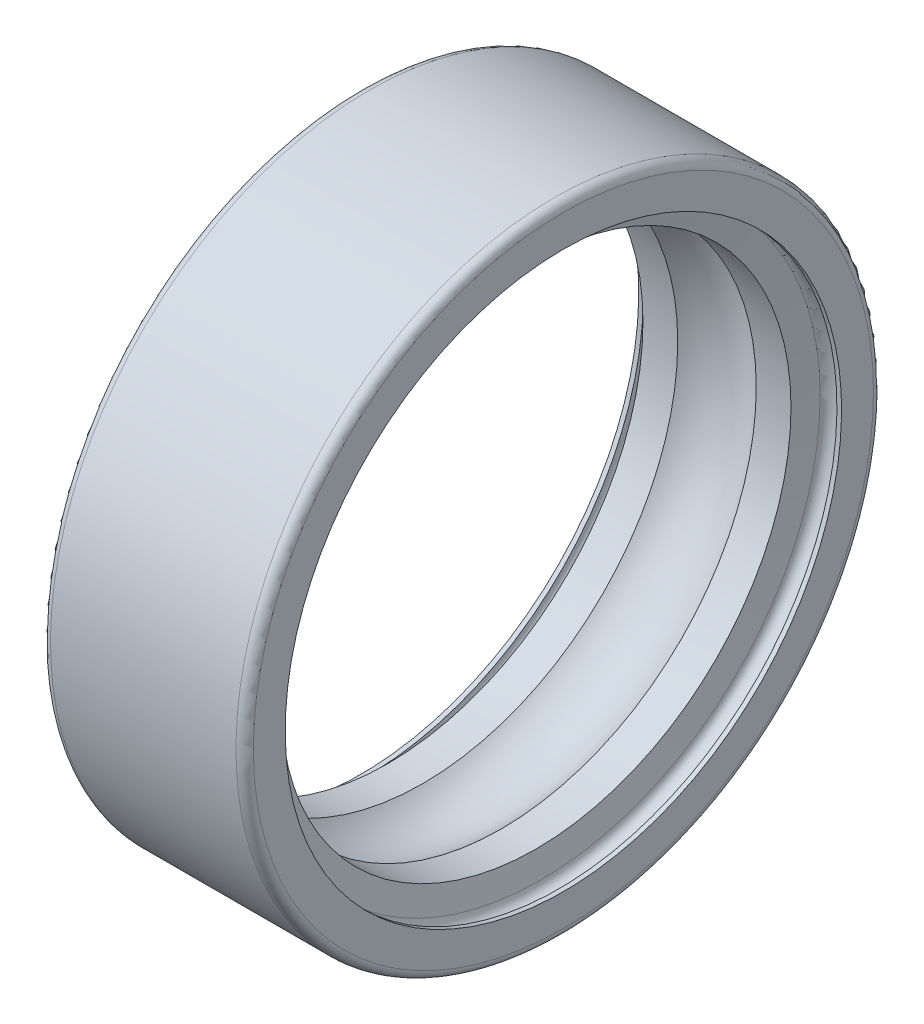
ISO-10303-21;
HEADER;
FILE_DESCRIPTION(('STEP AP214'),'2;1');
FILE_NAME('part.step','',(''),(''),'','','');
FILE_SCHEMA(('AUTOMOTIVE_DESIGN { 1 0 10303 214 1 1 1 1 }'));
ENDSEC;
DATA;
#1=APPLICATION_CONTEXT('core data for automotive mechanical design processes');
#2=APPLICATION_PROTOCOL_DEFINITION('international standard','automotive_design',2000,#1);
#3=PRODUCT_CONTEXT('',#1,'mechanical');
#4=PRODUCT('Part','Part','',(#3));
#5=PRODUCT_RELATED_PRODUCT_CATEGORY('part','',(#4));
#6=PRODUCT_DEFINITION_FORMATION('','',#4);
#7=PRODUCT_DEFINITION_CONTEXT('part definition',#1,'design');
#8=PRODUCT_DEFINITION('design','',#6,#7);
#9=PRODUCT_DEFINITION_SHAPE('','',#8);
#10=(LENGTH_UNIT() NAMED_UNIT(*) SI_UNIT(.MILLI.,.METRE.));
#11=(NAMED_UNIT(*) PLANE_ANGLE_UNIT() SI_UNIT($,.RADIAN.));
#12=(NAMED_UNIT(*) SI_UNIT($,.STERADIAN.) SOLID_ANGLE_UNIT());
#13=UNCERTAINTY_MEASURE_WITH_UNIT(LENGTH_MEASURE(1.E-05),#10,'distance_accuracy_value','');
#14=(GEOMETRIC_REPRESENTATION_CONTEXT(3) GLOBAL_UNCERTAINTY_ASSIGNED_CONTEXT((#13)) GLOBAL_UNIT_ASSIGNED_CONTEXT((#10,
#11,#12)) REPRESENTATION_CONTEXT('',''));
#15=CARTESIAN_POINT('',(0.,0.,0.));
#16=DIRECTION('',(0.,0.,1.));
#17=DIRECTION('',(1.,0.,0.));
#18=AXIS2_PLACEMENT_3D('',#15,#16,#17);
#19=CARTESIAN_POINT('',(6.52,0.,0.));
#20=DIRECTION('',(1.,0.,0.));
#21=DIRECTION('',(0.,0.,1.));
#22=AXIS2_PLACEMENT_3D('',#19,#20,#21);
#23=TOROIDAL_SURFACE('',#22,9.6,0.32);
#24=CARTESIAN_POINT('',(6.84,0.,0.));
#25=DIRECTION('',(-1.,0.,0.));
#26=DIRECTION('',(0.,1.,0.));
#27=AXIS2_PLACEMENT_3D('',#24,#25,#26);
#28=CIRCLE('',#27,9.6);
#29=CARTESIAN_POINT('',(6.84,9.6,0.));
#30=VERTEX_POINT('',#29);
#31=EDGE_CURVE('E11',#30,#30,#28,.T.);
#32=ORIENTED_EDGE('',*,*,#31,.F.);
#33=EDGE_LOOP('',(#32));
#34=FACE_BOUND('',#33,.T.);
#35=CARTESIAN_POINT('',(6.20486151903609,0.,0.));
#36=DIRECTION('',(-1.,0.,0.));
#37=DIRECTION('',(0.,1.,0.));
#38=AXIS2_PLACEMENT_3D('',#35,#36,#37);
#39=CIRCLE('',#38,9.65556741685342);
#40=CARTESIAN_POINT('',(6.20486151903609,9.65556741685342,0.));
#41=VERTEX_POINT('',#40);
#42=EDGE_CURVE('E82',#41,#41,#39,.T.);
#43=ORIENTED_EDGE('',*,*,#42,.T.);
#44=EDGE_LOOP('',(#43));
#45=FACE_BOUND('',#44,.T.);
#46=ADVANCED_FACE('F35',(#34,#45),#23,.F.);
#47=CARTESIAN_POINT('',(6.92,0.,0.));
#48=DIRECTION('',(-1.,0.,0.));
#49=DIRECTION('',(0.,1.,0.));
#50=AXIS2_PLACEMENT_3D('',#47,#48,#49);
#51=CYLINDRICAL_SURFACE('',#50,9.6);
#52=CARTESIAN_POINT('',(7.,0.,0.));
#53=DIRECTION('',(-1.,0.,0.));
#54=DIRECTION('',(0.,1.,0.));
#55=AXIS2_PLACEMENT_3D('',#52,#53,#54);
#56=CIRCLE('',#55,9.6);
#57=CARTESIAN_POINT('',(7.,9.6,0.));
#58=VERTEX_POINT('',#57);
#59=EDGE_CURVE('E45',#58,#58,#56,.T.);
#60=ORIENTED_EDGE('',*,*,#59,.F.);
#61=EDGE_LOOP('',(#60));
#62=FACE_BOUND('',#61,.T.);
#63=ORIENTED_EDGE('',*,*,#31,.T.);
#64=EDGE_LOOP('',(#63));
#65=FACE_BOUND('',#64,.T.);
#66=ADVANCED_FACE('F142',(#62,#65),#51,.F.);
#67=CARTESIAN_POINT('',(7.,10.15,0.));
#68=DIRECTION('',(1.,0.,0.));
#69=DIRECTION('',(0.,1.,0.));
#70=AXIS2_PLACEMENT_3D('',#67,#68,#69);
#71=PLANE('',#70);
#72=CARTESIAN_POINT('',(7.,0.,0.));
#73=DIRECTION('',(-1.,0.,0.));
#74=DIRECTION('',(0.,1.,0.));
#75=AXIS2_PLACEMENT_3D('',#72,#73,#74);
#76=CIRCLE('',#75,10.7);
#77=CARTESIAN_POINT('',(7.,10.7,0.));
#78=VERTEX_POINT('',#77);
#79=EDGE_CURVE('E102',#78,#78,#76,.T.);
#80=ORIENTED_EDGE('',*,*,#79,.F.);
#81=EDGE_LOOP('',(#80));
#82=FACE_BOUND('',#81,.T.);
#83=ORIENTED_EDGE('',*,*,#59,.T.);
#84=EDGE_LOOP('',(#83));
#85=FACE_BOUND('',#84,.T.);
#86=ADVANCED_FACE('F137',(#82,#85),#71,.T.);
#87=CARTESIAN_POINT('',(6.7,0.,0.));
#88=DIRECTION('',(1.,0.,0.));
#89=DIRECTION('',(0.,0.,1.));
#90=AXIS2_PLACEMENT_3D('',#87,#88,#89);
#91=TOROIDAL_SURFACE('',#90,10.7,0.3);
#92=CARTESIAN_POINT('',(6.7,0.,0.));
#93=DIRECTION('',(-1.,0.,0.));
#94=DIRECTION('',(0.,1.,0.));
#95=AXIS2_PLACEMENT_3D('',#92,#93,#94);
#96=CIRCLE('',#95,11.);
#97=CARTESIAN_POINT('',(6.7,11.,0.));
#98=VERTEX_POINT('',#97);
#99=EDGE_CURVE('E105',#98,#98,#96,.T.);
#100=ORIENTED_EDGE('',*,*,#99,.F.);
#101=EDGE_LOOP('',(#100));
#102=FACE_BOUND('',#101,.T.);
#103=ORIENTED_EDGE('',*,*,#79,.T.);
#104=EDGE_LOOP('',(#103));
#105=FACE_BOUND('',#104,.T.);
#106=ADVANCED_FACE('F103',(#102,#105),#91,.T.);
#107=CARTESIAN_POINT('',(3.5,0.,0.));
#108=DIRECTION('',(-1.,0.,0.));
#109=DIRECTION('',(0.,1.,0.));
#110=AXIS2_PLACEMENT_3D('',#107,#108,#109);
#111=CYLINDRICAL_SURFACE('',#110,11.);
#112=CARTESIAN_POINT('',(0.3,0.,0.));
#113=DIRECTION('',(-1.,0.,0.));
#114=DIRECTION('',(0.,1.,0.));
#115=AXIS2_PLACEMENT_3D('',#112,#113,#114);
#116=CIRCLE('',#115,11.);
#117=CARTESIAN_POINT('',(0.3,11.,0.));
#118=VERTEX_POINT('',#117);
#119=EDGE_CURVE('E108',#118,#118,#116,.T.);
#120=ORIENTED_EDGE('',*,*,#119,.F.);
#121=EDGE_LOOP('',(#120));
#122=FACE_BOUND('',#121,.T.);
#123=ORIENTED_EDGE('',*,*,#99,.T.);
#124=EDGE_LOOP('',(#123));
#125=FACE_BOUND('',#124,.T.);
#126=ADVANCED_FACE('F130',(#122,#125),#111,.T.);
#127=CARTESIAN_POINT('',(0.3,0.,0.));
#128=DIRECTION('',(1.,0.,0.));
#129=DIRECTION('',(0.,0.,1.));
#130=AXIS2_PLACEMENT_3D('',#127,#128,#129);
#131=TOROIDAL_SURFACE('',#130,10.7,0.3);
#132=CARTESIAN_POINT('',(0.,0.,0.));
#133=DIRECTION('',(-1.,0.,0.));
#134=DIRECTION('',(0.,1.,0.));
#135=AXIS2_PLACEMENT_3D('',#132,#133,#134);
#136=CIRCLE('',#135,10.7);
#137=CARTESIAN_POINT('',(0.,10.7,0.));
#138=VERTEX_POINT('',#137);
#139=EDGE_CURVE('E120',#138,#138,#136,.T.);
#140=ORIENTED_EDGE('',*,*,#139,.F.);
#141=EDGE_LOOP('',(#140));
#142=FACE_BOUND('',#141,.T.);
#143=ORIENTED_EDGE('',*,*,#119,.T.);
#144=EDGE_LOOP('',(#143));
#145=FACE_BOUND('',#144,.T.);
#146=ADVANCED_FACE('F128',(#142,#145),#131,.T.);
#147=CARTESIAN_POINT('',(0.,10.15,0.));
#148=DIRECTION('',(-1.,0.,0.));
#149=DIRECTION('',(0.,-1.,0.));
#150=AXIS2_PLACEMENT_3D('',#147,#148,#149);
#151=PLANE('',#150);
#152=CARTESIAN_POINT('',(0.,0.,0.));
#153=DIRECTION('',(-1.,0.,0.));
#154=DIRECTION('',(0.,1.,0.));
#155=AXIS2_PLACEMENT_3D('',#152,#153,#154);
#156=CIRCLE('',#155,9.6);
#157=CARTESIAN_POINT('',(0.,9.6,0.));
#158=VERTEX_POINT('',#157);
#159=EDGE_CURVE('E70',#158,#158,#156,.T.);
#160=ORIENTED_EDGE('',*,*,#159,.F.);
#161=EDGE_LOOP('',(#160));
#162=FACE_BOUND('',#161,.T.);
#163=ORIENTED_EDGE('',*,*,#139,.T.);
#164=EDGE_LOOP('',(#163));
#165=FACE_BOUND('',#164,.T.);
#166=ADVANCED_FACE('F155',(#162,#165),#151,.T.);
#167=CARTESIAN_POINT('',(0.08,0.,0.));
#168=DIRECTION('',(-1.,0.,0.));
#169=DIRECTION('',(0.,1.,0.));
#170=AXIS2_PLACEMENT_3D('',#167,#168,#169);
#171=CYLINDRICAL_SURFACE('',#170,9.6);
#172=CARTESIAN_POINT('',(0.16,0.,0.));
#173=DIRECTION('',(-1.,0.,0.));
#174=DIRECTION('',(0.,1.,0.));
#175=AXIS2_PLACEMENT_3D('',#172,#173,#174);
#176=CIRCLE('',#175,9.6);
#177=CARTESIAN_POINT('',(0.16,9.6,0.));
#178=VERTEX_POINT('',#177);
#179=EDGE_CURVE('E75',#178,#178,#176,.T.);
#180=ORIENTED_EDGE('',*,*,#179,.F.);
#181=EDGE_LOOP('',(#180));
#182=FACE_BOUND('',#181,.T.);
#183=ORIENTED_EDGE('',*,*,#159,.T.);
#184=EDGE_LOOP('',(#183));
#185=FACE_BOUND('',#184,.T.);
#186=ADVANCED_FACE('F177',(#182,#185),#171,.F.);
#187=CARTESIAN_POINT('',(0.48,0.,0.));
#188=DIRECTION('',(1.,0.,0.));
#189=DIRECTION('',(0.,0.,1.));
#190=AXIS2_PLACEMENT_3D('',#187,#188,#189);
#191=TOROIDAL_SURFACE('',#190,9.6,0.32);
#192=CARTESIAN_POINT('',(0.795138480963905,0.,0.));
#193=DIRECTION('',(-1.,0.,0.));
#194=DIRECTION('',(0.,1.,0.));
#195=AXIS2_PLACEMENT_3D('',#192,#193,#194);
#196=CIRCLE('',#195,9.65556741685342);
#197=CARTESIAN_POINT('',(0.795138480963905,9.65556741685342,0.));
#198=VERTEX_POINT('',#197);
#199=EDGE_CURVE('E114',#198,#198,#196,.T.);
#200=ORIENTED_EDGE('',*,*,#199,.F.);
#201=EDGE_LOOP('',(#200));
#202=FACE_BOUND('',#201,.T.);
#203=ORIENTED_EDGE('',*,*,#179,.T.);
#204=EDGE_LOOP('',(#203));
#205=FACE_BOUND('',#204,.T.);
#206=ADVANCED_FACE('F172',(#202,#205),#191,.F.);
#207=CARTESIAN_POINT('',(0.870568290667057,0.,0.));
#208=DIRECTION('',(-1.,0.,0.));
#209=DIRECTION('',(0.,1.,0.));
#210=AXIS2_PLACEMENT_3D('',#207,#208,#209);
#211=CONICAL_SURFACE('',#210,9.22778370842671,1.39626340159546);
#212=CARTESIAN_POINT('',(0.945998100370209,0.,0.));
#213=DIRECTION('',(-1.,0.,0.));
#214=DIRECTION('',(0.,1.,0.));
#215=AXIS2_PLACEMENT_3D('',#212,#213,#214);
#216=CIRCLE('',#215,8.8);
#217=CARTESIAN_POINT('',(0.945998100370209,8.8,0.));
#218=VERTEX_POINT('',#217);
#219=EDGE_CURVE('E116',#218,#218,#216,.T.);
#220=ORIENTED_EDGE('',*,*,#219,.F.);
#221=EDGE_LOOP('',(#220));
#222=FACE_BOUND('',#221,.T.);
#223=ORIENTED_EDGE('',*,*,#199,.T.);
#224=EDGE_LOOP('',(#223));
#225=FACE_BOUND('',#224,.T.);
#226=ADVANCED_FACE('F167',(#222,#225),#211,.F.);
#227=CARTESIAN_POINT('',(1.54555158912263,0.,0.));
#228=DIRECTION('',(-1.,0.,0.));
#229=DIRECTION('',(0.,1.,0.));
#230=AXIS2_PLACEMENT_3D('',#227,#228,#229);
#231=CYLINDRICAL_SURFACE('',#230,8.8);
#232=CARTESIAN_POINT('',(2.14510507787504,0.,0.));
#233=DIRECTION('',(-1.,0.,0.));
#234=DIRECTION('',(0.,1.,0.));
#235=AXIS2_PLACEMENT_3D('',#232,#233,#234);
#236=CIRCLE('',#235,8.8);
#237=CARTESIAN_POINT('',(2.14510507787504,8.8,0.));
#238=VERTEX_POINT('',#237);
#239=EDGE_CURVE('E91',#238,#238,#236,.T.);
#240=ORIENTED_EDGE('',*,*,#239,.F.);
#241=EDGE_LOOP('',(#240));
#242=FACE_BOUND('',#241,.T.);
#243=ORIENTED_EDGE('',*,*,#219,.T.);
#244=EDGE_LOOP('',(#243));
#245=FACE_BOUND('',#244,.T.);
#246=ADVANCED_FACE('F159',(#242,#245),#231,.F.);
#247=CARTESIAN_POINT('',(3.5,0.,0.));
#248=DIRECTION('',(1.,0.,0.));
#249=DIRECTION('',(0.,0.,1.));
#250=AXIS2_PLACEMENT_3D('',#247,#248,#249);
#251=TOROIDAL_SURFACE('',#250,7.35,1.9845);
#252=CARTESIAN_POINT('',(4.85489492212496,0.,0.));
#253=DIRECTION('',(-1.,0.,0.));
#254=DIRECTION('',(0.,1.,0.));
#255=AXIS2_PLACEMENT_3D('',#252,#253,#254);
#256=CIRCLE('',#255,8.8);
#257=CARTESIAN_POINT('',(4.85489492212496,8.8,0.));
#258=VERTEX_POINT('',#257);
#259=EDGE_CURVE('E39',#258,#258,#256,.T.);
#260=ORIENTED_EDGE('',*,*,#259,.F.);
#261=EDGE_LOOP('',(#260));
#262=FACE_BOUND('',#261,.T.);
#263=ORIENTED_EDGE('',*,*,#239,.T.);
#264=EDGE_LOOP('',(#263));
#265=FACE_BOUND('',#264,.T.);
#266=ADVANCED_FACE('F157',(#262,#265),#251,.F.);
#267=CARTESIAN_POINT('',(5.45444841087738,0.,0.));
#268=DIRECTION('',(-1.,0.,0.));
#269=DIRECTION('',(0.,1.,0.));
#270=AXIS2_PLACEMENT_3D('',#267,#268,#269);
#271=CYLINDRICAL_SURFACE('',#270,8.8);
#272=CARTESIAN_POINT('',(6.05400189962979,0.,0.));
#273=DIRECTION('',(-1.,0.,0.));
#274=DIRECTION('',(0.,1.,0.));
#275=AXIS2_PLACEMENT_3D('',#272,#273,#274);
#276=CIRCLE('',#275,8.8);
#277=CARTESIAN_POINT('',(6.05400189962979,8.8,0.));
#278=VERTEX_POINT('',#277);
#279=EDGE_CURVE('E117',#278,#278,#276,.T.);
#280=ORIENTED_EDGE('',*,*,#279,.F.);
#281=EDGE_LOOP('',(#280));
#282=FACE_BOUND('',#281,.T.);
#283=ORIENTED_EDGE('',*,*,#259,.T.);
#284=EDGE_LOOP('',(#283));
#285=FACE_BOUND('',#284,.T.);
#286=ADVANCED_FACE('F37',(#282,#285),#271,.F.);
#287=CARTESIAN_POINT('',(6.12943170933294,0.,0.));
#288=DIRECTION('',(1.,0.,0.));
#289=DIRECTION('',(0.,1.,0.));
#290=AXIS2_PLACEMENT_3D('',#287,#288,#289);
#291=CONICAL_SURFACE('',#290,9.22778370842671,1.39626340159546);
#292=ORIENTED_EDGE('',*,*,#42,.F.);
#293=EDGE_LOOP('',(#292));
#294=FACE_BOUND('',#293,.T.);
#295=ORIENTED_EDGE('',*,*,#279,.T.);
#296=EDGE_LOOP('',(#295));
#297=FACE_BOUND('',#296,.T.);
#298=ADVANCED_FACE('F165',(#294,#297),#291,.F.);
#299=CLOSED_SHELL('',(#46,#66,#86,#106,#126,#146,#166,#186,#206,#226,#246,#266,#286,#298));
#300=MANIFOLD_SOLID_BREP('B2',#299);
#301=ADVANCED_BREP_SHAPE_REPRESENTATION('',(#18,#300),#14);
#302=SHAPE_DEFINITION_REPRESENTATION(#9,#301);
ENDSEC;
END-ISO-10303-21;
